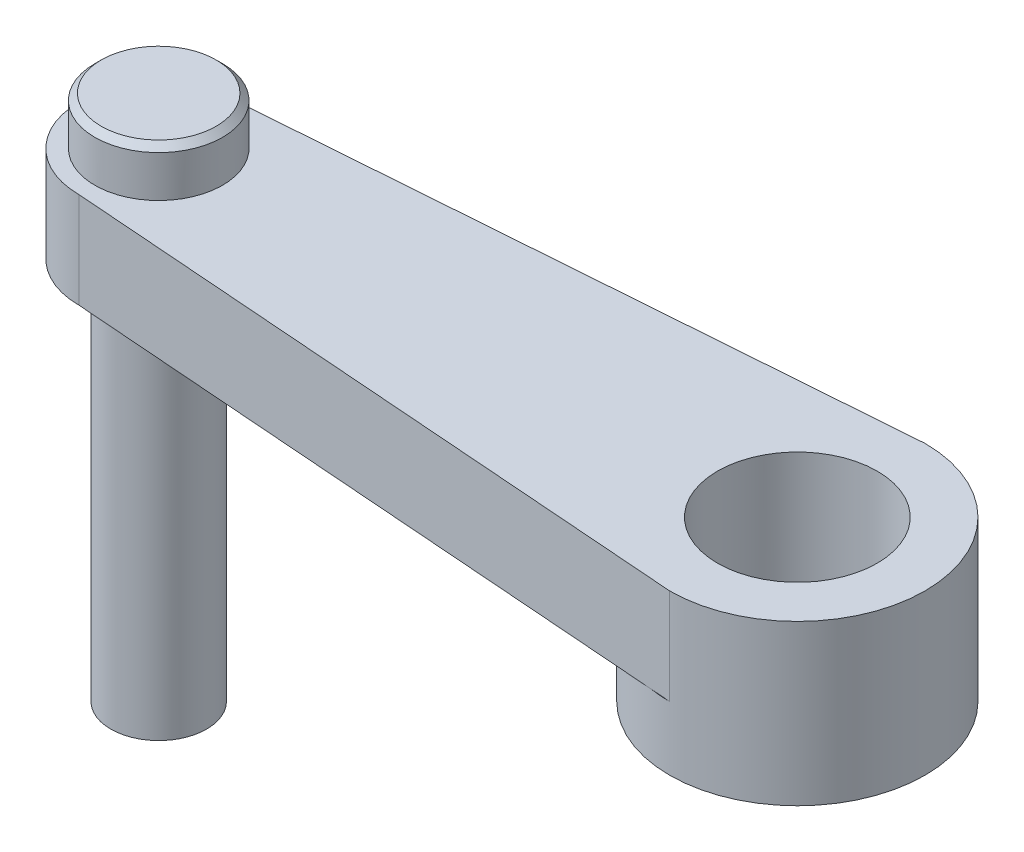
ISO-10303-21;
HEADER;
FILE_DESCRIPTION(('STEP AP214'),'2;1');
FILE_NAME('part.step','',(''),(''),'','','');
FILE_SCHEMA(('AUTOMOTIVE_DESIGN { 1 0 10303 214 1 1 1 1 }'));
ENDSEC;
DATA;
#1=APPLICATION_CONTEXT('core data for automotive mechanical design processes');
#2=APPLICATION_PROTOCOL_DEFINITION('international standard','automotive_design',2000,#1);
#3=PRODUCT_CONTEXT('',#1,'mechanical');
#4=PRODUCT('Part','Part','',(#3));
#5=PRODUCT_RELATED_PRODUCT_CATEGORY('part','',(#4));
#6=PRODUCT_DEFINITION_FORMATION('','',#4);
#7=PRODUCT_DEFINITION_CONTEXT('part definition',#1,'design');
#8=PRODUCT_DEFINITION('design','',#6,#7);
#9=PRODUCT_DEFINITION_SHAPE('','',#8);
#10=(LENGTH_UNIT() NAMED_UNIT(*) SI_UNIT(.MILLI.,.METRE.));
#11=(NAMED_UNIT(*) PLANE_ANGLE_UNIT() SI_UNIT($,.RADIAN.));
#12=(NAMED_UNIT(*) SI_UNIT($,.STERADIAN.) SOLID_ANGLE_UNIT());
#13=UNCERTAINTY_MEASURE_WITH_UNIT(LENGTH_MEASURE(1.E-05),#10,'distance_accuracy_value','');
#14=(GEOMETRIC_REPRESENTATION_CONTEXT(3) GLOBAL_UNCERTAINTY_ASSIGNED_CONTEXT((#13)) GLOBAL_UNIT_ASSIGNED_CONTEXT((#10,
#11,#12)) REPRESENTATION_CONTEXT('',''));
#15=CARTESIAN_POINT('',(0.,0.,0.));
#16=DIRECTION('',(0.,0.,1.));
#17=DIRECTION('',(1.,0.,0.));
#18=AXIS2_PLACEMENT_3D('',#15,#16,#17);
#19=CARTESIAN_POINT('',(0.,3.,-2.5));
#20=DIRECTION('',(0.,-1.,0.));
#21=DIRECTION('',(0.,0.,-1.));
#22=AXIS2_PLACEMENT_3D('',#19,#20,#21);
#23=PLANE('',#22);
#24=CARTESIAN_POINT('',(0.,3.,-2.5));
#25=DIRECTION('',(0.,-1.,0.));
#26=DIRECTION('',(0.,0.,-1.));
#27=AXIS2_PLACEMENT_3D('',#24,#25,#26);
#28=CIRCLE('',#27,2.);
#29=CARTESIAN_POINT('',(0.,3.,-4.5));
#30=VERTEX_POINT('',#29);
#31=EDGE_CURVE('E113',#30,#30,#28,.F.);
#32=ORIENTED_EDGE('',*,*,#31,.F.);
#33=EDGE_LOOP('',(#32));
#34=FACE_BOUND('',#33,.T.);
#35=CARTESIAN_POINT('',(0.,3.,-2.5));
#36=DIRECTION('',(0.,1.,0.));
#37=DIRECTION('',(0.,0.,-1.));
#38=AXIS2_PLACEMENT_3D('',#35,#36,#37);
#39=CIRCLE('',#38,2.5);
#40=CARTESIAN_POINT('',(0.,3.,-5.));
#41=VERTEX_POINT('',#40);
#42=CARTESIAN_POINT('',(0.,3.,0.));
#43=VERTEX_POINT('',#42);
#44=EDGE_CURVE('E94',#41,#43,#39,.T.);
#45=ORIENTED_EDGE('',*,*,#44,.T.);
#46=DIRECTION('',(0.997199309888456,0.,0.0747899482416342));
#47=VECTOR('',#46,1.);
#48=CARTESIAN_POINT('',(0.,3.,0.));
#49=LINE('',#48,#47);
#50=CARTESIAN_POINT('',(20.,3.,1.5));
#51=VERTEX_POINT('',#50);
#52=EDGE_CURVE('E84',#43,#51,#49,.T.);
#53=ORIENTED_EDGE('',*,*,#52,.T.);
#54=CARTESIAN_POINT('',(20.,3.,-2.5));
#55=DIRECTION('',(0.,1.,0.));
#56=DIRECTION('',(0.,0.,1.));
#57=AXIS2_PLACEMENT_3D('',#54,#55,#56);
#58=CIRCLE('',#57,4.);
#59=CARTESIAN_POINT('',(20.,3.,-6.5));
#60=VERTEX_POINT('',#59);
#61=EDGE_CURVE('E299',#51,#60,#58,.T.);
#62=ORIENTED_EDGE('',*,*,#61,.T.);
#63=DIRECTION('',(-0.997199309888456,0.,0.0747899482416342));
#64=VECTOR('',#63,1.);
#65=CARTESIAN_POINT('',(0.,3.,-5.));
#66=LINE('',#65,#64);
#67=EDGE_CURVE('E57',#60,#41,#66,.T.);
#68=ORIENTED_EDGE('',*,*,#67,.T.);
#69=EDGE_LOOP('',(#45,#53,#62,#68));
#70=FACE_BOUND('',#69,.T.);
#71=CARTESIAN_POINT('',(20.,3.,-2.5));
#72=DIRECTION('',(0.,1.,0.));
#73=DIRECTION('',(0.,0.,1.));
#74=AXIS2_PLACEMENT_3D('',#71,#72,#73);
#75=CIRCLE('',#74,2.5);
#76=CARTESIAN_POINT('',(20.,3.,0.));
#77=VERTEX_POINT('',#76);
#78=EDGE_CURVE('E123',#77,#77,#75,.T.);
#79=ORIENTED_EDGE('',*,*,#78,.F.);
#80=EDGE_LOOP('',(#79));
#81=FACE_BOUND('',#80,.T.);
#82=ADVANCED_FACE('F33',(#34,#70,#81),#23,.F.);
#83=CARTESIAN_POINT('',(0.,0.,-2.5));
#84=DIRECTION('',(0.,-1.,0.));
#85=DIRECTION('',(0.,0.,-1.));
#86=AXIS2_PLACEMENT_3D('',#83,#84,#85);
#87=PLANE('',#86);
#88=CARTESIAN_POINT('',(20.,0.,-2.5));
#89=DIRECTION('',(0.,-1.,0.));
#90=DIRECTION('',(0.,0.,-1.));
#91=AXIS2_PLACEMENT_3D('',#88,#89,#90);
#92=CIRCLE('',#91,4.);
#93=CARTESIAN_POINT('',(19.4033561218148,0.,1.45525170913611));
#94=VERTEX_POINT('',#93);
#95=CARTESIAN_POINT('',(19.4033561218148,0.,-6.45525170913611));
#96=VERTEX_POINT('',#95);
#97=EDGE_CURVE('E48',#94,#96,#92,.T.);
#98=ORIENTED_EDGE('',*,*,#97,.F.);
#99=DIRECTION('',(0.997199309888456,0.,0.0747899482416342));
#100=VECTOR('',#99,1.);
#101=CARTESIAN_POINT('',(0.,0.,0.));
#102=LINE('',#101,#100);
#103=CARTESIAN_POINT('',(0.,0.,0.));
#104=VERTEX_POINT('',#103);
#105=EDGE_CURVE('E101',#104,#94,#102,.T.);
#106=ORIENTED_EDGE('',*,*,#105,.F.);
#107=CARTESIAN_POINT('',(0.,0.,-2.5));
#108=DIRECTION('',(0.,1.,0.));
#109=DIRECTION('',(0.,0.,-1.));
#110=AXIS2_PLACEMENT_3D('',#107,#108,#109);
#111=CIRCLE('',#110,2.5);
#112=CARTESIAN_POINT('',(0.,0.,-5.));
#113=VERTEX_POINT('',#112);
#114=EDGE_CURVE('E100',#113,#104,#111,.T.);
#115=ORIENTED_EDGE('',*,*,#114,.F.);
#116=DIRECTION('',(-0.997199309888456,0.,0.0747899482416342));
#117=VECTOR('',#116,1.);
#118=CARTESIAN_POINT('',(0.,0.,-5.));
#119=LINE('',#118,#117);
#120=EDGE_CURVE('E76',#96,#113,#119,.T.);
#121=ORIENTED_EDGE('',*,*,#120,.F.);
#122=EDGE_LOOP('',(#98,#106,#115,#121));
#123=FACE_BOUND('',#122,.T.);
#124=CARTESIAN_POINT('',(0.,0.,-2.5));
#125=DIRECTION('',(0.,-1.,0.));
#126=DIRECTION('',(0.,0.,-1.));
#127=AXIS2_PLACEMENT_3D('',#124,#125,#126);
#128=CIRCLE('',#127,1.5);
#129=CARTESIAN_POINT('',(0.,0.,-4.));
#130=VERTEX_POINT('',#129);
#131=EDGE_CURVE('E130',#130,#130,#128,.T.);
#132=ORIENTED_EDGE('',*,*,#131,.F.);
#133=EDGE_LOOP('',(#132));
#134=FACE_BOUND('',#133,.T.);
#135=ADVANCED_FACE('F97',(#123,#134),#87,.T.);
#136=CARTESIAN_POINT('',(0.,3.,-2.5));
#137=DIRECTION('',(0.,-1.,0.));
#138=DIRECTION('',(0.,0.,-1.));
#139=AXIS2_PLACEMENT_3D('',#136,#137,#138);
#140=CYLINDRICAL_SURFACE('',#139,2.5);
#141=ORIENTED_EDGE('',*,*,#114,.T.);
#142=DIRECTION('',(0.,-1.,0.));
#143=VECTOR('',#142,1.);
#144=CARTESIAN_POINT('',(0.,3.,0.));
#145=LINE('',#144,#143);
#146=EDGE_CURVE('E114',#43,#104,#145,.T.);
#147=ORIENTED_EDGE('',*,*,#146,.F.);
#148=ORIENTED_EDGE('',*,*,#44,.F.);
#149=DIRECTION('',(0.,-1.,0.));
#150=VECTOR('',#149,1.);
#151=CARTESIAN_POINT('',(0.,3.,-5.));
#152=LINE('',#151,#150);
#153=EDGE_CURVE('E178',#41,#113,#152,.T.);
#154=ORIENTED_EDGE('',*,*,#153,.T.);
#155=EDGE_LOOP('',(#141,#147,#148,#154));
#156=FACE_BOUND('',#155,.T.);
#157=ADVANCED_FACE('F159',(#156),#140,.T.);
#158=CARTESIAN_POINT('',(0.,3.,0.));
#159=DIRECTION('',(0.0747899482416342,0.,-0.997199309888456));
#160=DIRECTION('',(-0.997199309888456,0.,-0.0747899482416342));
#161=AXIS2_PLACEMENT_3D('',#158,#159,#160);
#162=PLANE('',#161);
#163=ORIENTED_EDGE('',*,*,#105,.T.);
#164=CARTESIAN_POINT('',(20.,0.,1.5));
#165=VERTEX_POINT('',#164);
#166=EDGE_CURVE('E179',#94,#165,#102,.T.);
#167=ORIENTED_EDGE('',*,*,#166,.T.);
#168=DIRECTION('',(0.,-1.,0.));
#169=VECTOR('',#168,1.);
#170=CARTESIAN_POINT('',(20.,3.,1.5));
#171=LINE('',#170,#169);
#172=EDGE_CURVE('E117',#51,#165,#171,.T.);
#173=ORIENTED_EDGE('',*,*,#172,.F.);
#174=ORIENTED_EDGE('',*,*,#52,.F.);
#175=ORIENTED_EDGE('',*,*,#146,.T.);
#176=EDGE_LOOP('',(#163,#167,#173,#174,#175));
#177=FACE_BOUND('',#176,.T.);
#178=ADVANCED_FACE('F170',(#177),#162,.F.);
#179=CARTESIAN_POINT('',(20.,3.,-2.5));
#180=DIRECTION('',(0.,-1.,0.));
#181=DIRECTION('',(0.,0.,-1.));
#182=AXIS2_PLACEMENT_3D('',#179,#180,#181);
#183=CYLINDRICAL_SURFACE('',#182,4.);
#184=ORIENTED_EDGE('',*,*,#172,.T.);
#185=EDGE_CURVE('E105',#165,#94,#92,.T.);
#186=ORIENTED_EDGE('',*,*,#185,.T.);
#187=ORIENTED_EDGE('',*,*,#97,.T.);
#188=CARTESIAN_POINT('',(20.,0.,-6.5));
#189=VERTEX_POINT('',#188);
#190=EDGE_CURVE('E102',#96,#189,#92,.T.);
#191=ORIENTED_EDGE('',*,*,#190,.T.);
#192=DIRECTION('',(0.,-1.,0.));
#193=VECTOR('',#192,1.);
#194=CARTESIAN_POINT('',(20.,3.,-6.5));
#195=LINE('',#194,#193);
#196=EDGE_CURVE('E90',#60,#189,#195,.T.);
#197=ORIENTED_EDGE('',*,*,#196,.F.);
#198=ORIENTED_EDGE('',*,*,#61,.F.);
#199=EDGE_LOOP('',(#184,#186,#187,#191,#197,#198));
#200=FACE_BOUND('',#199,.T.);
#201=CARTESIAN_POINT('',(20.,-2.,-2.5));
#202=DIRECTION('',(0.,-1.,0.));
#203=DIRECTION('',(0.,0.,-1.));
#204=AXIS2_PLACEMENT_3D('',#201,#202,#203);
#205=CIRCLE('',#204,4.);
#206=CARTESIAN_POINT('',(20.,-2.,-6.5));
#207=VERTEX_POINT('',#206);
#208=EDGE_CURVE('E121',#207,#207,#205,.T.);
#209=ORIENTED_EDGE('',*,*,#208,.F.);
#210=EDGE_LOOP('',(#209));
#211=FACE_BOUND('',#210,.T.);
#212=ADVANCED_FACE('F110',(#200,#211),#183,.T.);
#213=CARTESIAN_POINT('',(0.,3.,-5.));
#214=DIRECTION('',(0.0747899482416342,0.,0.997199309888456));
#215=DIRECTION('',(0.997199309888456,0.,-0.0747899482416342));
#216=AXIS2_PLACEMENT_3D('',#213,#214,#215);
#217=PLANE('',#216);
#218=EDGE_CURVE('E87',#189,#96,#119,.T.);
#219=ORIENTED_EDGE('',*,*,#218,.T.);
#220=ORIENTED_EDGE('',*,*,#120,.T.);
#221=ORIENTED_EDGE('',*,*,#153,.F.);
#222=ORIENTED_EDGE('',*,*,#67,.F.);
#223=ORIENTED_EDGE('',*,*,#196,.T.);
#224=EDGE_LOOP('',(#219,#220,#221,#222,#223));
#225=FACE_BOUND('',#224,.T.);
#226=ADVANCED_FACE('F88',(#225),#217,.F.);
#227=CARTESIAN_POINT('',(20.,3.,-2.5));
#228=DIRECTION('',(0.,-1.,0.));
#229=DIRECTION('',(0.,0.,-1.));
#230=AXIS2_PLACEMENT_3D('',#227,#228,#229);
#231=CYLINDRICAL_SURFACE('',#230,2.5);
#232=ORIENTED_EDGE('',*,*,#78,.T.);
#233=EDGE_LOOP('',(#232));
#234=FACE_BOUND('',#233,.T.);
#235=CARTESIAN_POINT('',(20.,-2.,-2.5));
#236=DIRECTION('',(0.,-1.,0.));
#237=DIRECTION('',(0.,0.,-1.));
#238=AXIS2_PLACEMENT_3D('',#235,#236,#237);
#239=CIRCLE('',#238,2.5);
#240=CARTESIAN_POINT('',(20.,-2.,-5.));
#241=VERTEX_POINT('',#240);
#242=EDGE_CURVE('E106',#241,#241,#239,.T.);
#243=ORIENTED_EDGE('',*,*,#242,.T.);
#244=EDGE_LOOP('',(#243));
#245=FACE_BOUND('',#244,.T.);
#246=ADVANCED_FACE('F163',(#234,#245),#231,.F.);
#247=CARTESIAN_POINT('',(20.,0.,-2.5));
#248=DIRECTION('',(0.,-1.,0.));
#249=DIRECTION('',(0.,0.,-1.));
#250=AXIS2_PLACEMENT_3D('',#247,#248,#249);
#251=PLANE('',#250);
#252=ORIENTED_EDGE('',*,*,#218,.F.);
#253=ORIENTED_EDGE('',*,*,#190,.F.);
#254=EDGE_LOOP('',(#252,#253));
#255=FACE_BOUND('',#254,.T.);
#256=ADVANCED_FACE('F103',(#255),#251,.F.);
#257=CARTESIAN_POINT('',(20.,-2.,-2.5));
#258=DIRECTION('',(0.,-1.,0.));
#259=DIRECTION('',(0.,0.,-1.));
#260=AXIS2_PLACEMENT_3D('',#257,#258,#259);
#261=PLANE('',#260);
#262=ORIENTED_EDGE('',*,*,#208,.T.);
#263=EDGE_LOOP('',(#262));
#264=FACE_BOUND('',#263,.T.);
#265=ORIENTED_EDGE('',*,*,#242,.F.);
#266=EDGE_LOOP('',(#265));
#267=FACE_BOUND('',#266,.T.);
#268=ADVANCED_FACE('F229',(#264,#267),#261,.T.);
#269=ORIENTED_EDGE('',*,*,#166,.F.);
#270=ORIENTED_EDGE('',*,*,#185,.F.);
#271=EDGE_LOOP('',(#269,#270));
#272=FACE_BOUND('',#271,.T.);
#273=ADVANCED_FACE('F150',(#272),#251,.F.);
#274=CARTESIAN_POINT('',(0.,-12.,-2.5));
#275=DIRECTION('',(0.,1.,0.));
#276=DIRECTION('',(0.,0.,1.));
#277=AXIS2_PLACEMENT_3D('',#274,#275,#276);
#278=CYLINDRICAL_SURFACE('',#277,1.5);
#279=ORIENTED_EDGE('',*,*,#131,.T.);
#280=EDGE_LOOP('',(#279));
#281=FACE_BOUND('',#280,.T.);
#282=CARTESIAN_POINT('',(0.,-12.,-2.5));
#283=DIRECTION('',(0.,1.,0.));
#284=DIRECTION('',(0.,0.,1.));
#285=AXIS2_PLACEMENT_3D('',#282,#283,#284);
#286=CIRCLE('',#285,1.5);
#287=CARTESIAN_POINT('',(0.,-12.,-1.));
#288=VERTEX_POINT('',#287);
#289=EDGE_CURVE('E133',#288,#288,#286,.T.);
#290=ORIENTED_EDGE('',*,*,#289,.T.);
#291=EDGE_LOOP('',(#290));
#292=FACE_BOUND('',#291,.T.);
#293=ADVANCED_FACE('F137',(#281,#292),#278,.T.);
#294=CARTESIAN_POINT('',(0.,-12.,-2.5));
#295=DIRECTION('',(0.,1.,0.));
#296=DIRECTION('',(0.,0.,1.));
#297=AXIS2_PLACEMENT_3D('',#294,#295,#296);
#298=PLANE('',#297);
#299=ORIENTED_EDGE('',*,*,#289,.F.);
#300=EDGE_LOOP('',(#299));
#301=FACE_BOUND('',#300,.T.);
#302=ADVANCED_FACE('F139',(#301),#298,.F.);
#303=CARTESIAN_POINT('',(0.,4.5,-2.5));
#304=DIRECTION('',(0.,-1.,0.));
#305=DIRECTION('',(0.,0.,-1.));
#306=AXIS2_PLACEMENT_3D('',#303,#304,#305);
#307=CYLINDRICAL_SURFACE('',#306,2.);
#308=CARTESIAN_POINT('',(0.,4.3,-2.5));
#309=DIRECTION('',(0.,1.,0.));
#310=DIRECTION('',(0.,0.,1.));
#311=AXIS2_PLACEMENT_3D('',#308,#309,#310);
#312=CIRCLE('',#311,2.);
#313=CARTESIAN_POINT('',(0.,4.3,-0.5));
#314=VERTEX_POINT('',#313);
#315=EDGE_CURVE('E11',#314,#314,#312,.F.);
#316=ORIENTED_EDGE('',*,*,#315,.T.);
#317=EDGE_LOOP('',(#316));
#318=FACE_BOUND('',#317,.T.);
#319=ORIENTED_EDGE('',*,*,#31,.T.);
#320=EDGE_LOOP('',(#319));
#321=FACE_BOUND('',#320,.T.);
#322=ADVANCED_FACE('F141',(#318,#321),#307,.T.);
#323=CARTESIAN_POINT('',(0.,4.5,-2.5));
#324=DIRECTION('',(0.,1.,0.));
#325=DIRECTION('',(0.,0.,1.));
#326=AXIS2_PLACEMENT_3D('',#323,#324,#325);
#327=PLANE('',#326);
#328=CARTESIAN_POINT('',(0.,4.5,-2.5));
#329=DIRECTION('',(0.,1.,0.));
#330=DIRECTION('',(0.,0.,1.));
#331=AXIS2_PLACEMENT_3D('',#328,#329,#330);
#332=CIRCLE('',#331,1.8);
#333=CARTESIAN_POINT('',(0.,4.5,-0.699999999999998));
#334=VERTEX_POINT('',#333);
#335=EDGE_CURVE('E41',#334,#334,#332,.T.);
#336=ORIENTED_EDGE('',*,*,#335,.T.);
#337=EDGE_LOOP('',(#336));
#338=FACE_BOUND('',#337,.T.);
#339=ADVANCED_FACE('F147',(#338),#327,.T.);
#340=CARTESIAN_POINT('',(0.,4.5,-2.5));
#341=DIRECTION('',(0.,-1.,0.));
#342=DIRECTION('',(0.,0.,-1.));
#343=AXIS2_PLACEMENT_3D('',#340,#341,#342);
#344=CONICAL_SURFACE('',#343,1.8,0.785398163397448);
#345=ORIENTED_EDGE('',*,*,#315,.F.);
#346=EDGE_LOOP('',(#345));
#347=FACE_BOUND('',#346,.T.);
#348=ORIENTED_EDGE('',*,*,#335,.F.);
#349=EDGE_LOOP('',(#348));
#350=FACE_BOUND('',#349,.T.);
#351=ADVANCED_FACE('F35',(#347,#350),#344,.T.);
#352=CLOSED_SHELL('',(#82,#135,#157,#178,#212,#226,#246,#256,#268,#273,#293,#302,#322,#339,#351));
#353=MANIFOLD_SOLID_BREP('B2',#352);
#354=ADVANCED_BREP_SHAPE_REPRESENTATION('',(#18,#353),#14);
#355=SHAPE_DEFINITION_REPRESENTATION(#9,#354);
ENDSEC;
END-ISO-10303-21;
